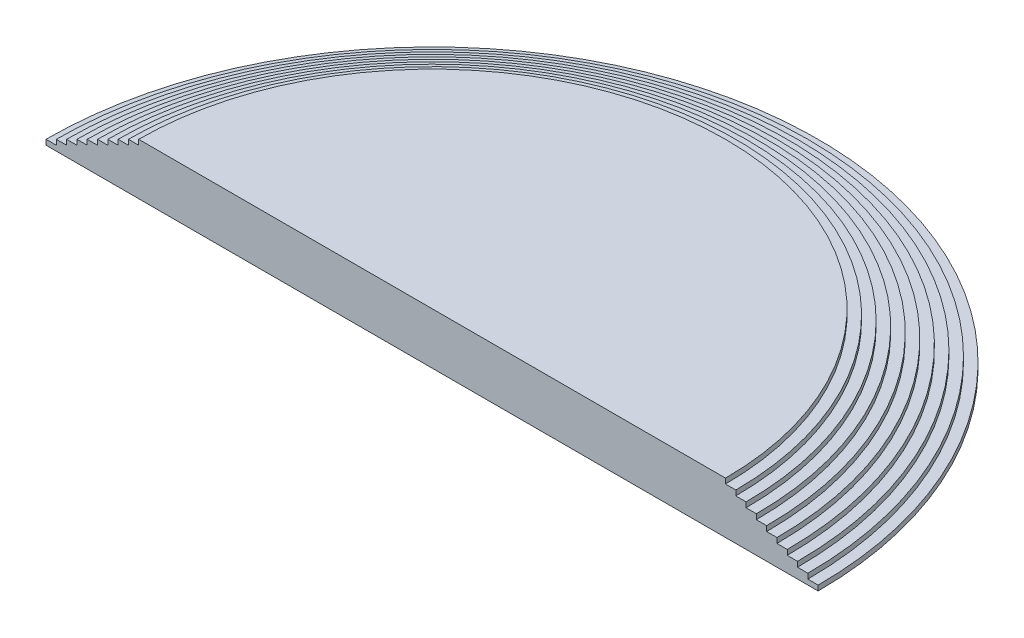
ISO-10303-21;
HEADER;
FILE_DESCRIPTION(('STEP AP214'),'2;1');
FILE_NAME('part.step','',(''),(''),'','','');
FILE_SCHEMA(('AUTOMOTIVE_DESIGN { 1 0 10303 214 1 1 1 1 }'));
ENDSEC;
DATA;
#1=APPLICATION_CONTEXT('core data for automotive mechanical design processes');
#2=APPLICATION_PROTOCOL_DEFINITION('international standard','automotive_design',2000,#1);
#3=PRODUCT_CONTEXT('',#1,'mechanical');
#4=PRODUCT('Part','Part','',(#3));
#5=PRODUCT_RELATED_PRODUCT_CATEGORY('part','',(#4));
#6=PRODUCT_DEFINITION_FORMATION('','',#4);
#7=PRODUCT_DEFINITION_CONTEXT('part definition',#1,'design');
#8=PRODUCT_DEFINITION('design','',#6,#7);
#9=PRODUCT_DEFINITION_SHAPE('','',#8);
#10=(LENGTH_UNIT() NAMED_UNIT(*) SI_UNIT(.MILLI.,.METRE.));
#11=(NAMED_UNIT(*) PLANE_ANGLE_UNIT() SI_UNIT($,.RADIAN.));
#12=(NAMED_UNIT(*) SI_UNIT($,.STERADIAN.) SOLID_ANGLE_UNIT());
#13=UNCERTAINTY_MEASURE_WITH_UNIT(LENGTH_MEASURE(1.E-05),#10,'distance_accuracy_value','');
#14=(GEOMETRIC_REPRESENTATION_CONTEXT(3) GLOBAL_UNCERTAINTY_ASSIGNED_CONTEXT((#13)) GLOBAL_UNIT_ASSIGNED_CONTEXT((#10,
#11,#12)) REPRESENTATION_CONTEXT('',''));
#15=CARTESIAN_POINT('',(0.,0.,0.));
#16=DIRECTION('',(0.,0.,1.));
#17=DIRECTION('',(1.,0.,0.));
#18=AXIS2_PLACEMENT_3D('',#15,#16,#17);
#19=CARTESIAN_POINT('',(0.,0.2,0.));
#20=DIRECTION('',(0.,-1.,0.));
#21=DIRECTION('',(0.,0.,-1.));
#22=AXIS2_PLACEMENT_3D('',#19,#20,#21);
#23=CYLINDRICAL_SURFACE('',#22,15.);
#24=CARTESIAN_POINT('',(0.,0.,0.));
#25=DIRECTION('',(0.,1.,0.));
#26=DIRECTION('',(0.,0.,1.));
#27=AXIS2_PLACEMENT_3D('',#24,#25,#26);
#28=CIRCLE('',#27,15.);
#29=CARTESIAN_POINT('',(15.,0.,0.));
#30=VERTEX_POINT('',#29);
#31=CARTESIAN_POINT('',(-15.,0.,0.));
#32=VERTEX_POINT('',#31);
#33=EDGE_CURVE('E309',#30,#32,#28,.T.);
#34=ORIENTED_EDGE('',*,*,#33,.T.);
#35=DIRECTION('',(0.,-1.,0.));
#36=VECTOR('',#35,1.);
#37=CARTESIAN_POINT('',(-15.,0.2,0.));
#38=LINE('',#37,#36);
#39=CARTESIAN_POINT('',(-15.,0.2,0.));
#40=VERTEX_POINT('',#39);
#41=EDGE_CURVE('E11',#40,#32,#38,.T.);
#42=ORIENTED_EDGE('',*,*,#41,.F.);
#43=CARTESIAN_POINT('',(0.,0.2,0.));
#44=DIRECTION('',(0.,1.,0.));
#45=DIRECTION('',(0.,0.,1.));
#46=AXIS2_PLACEMENT_3D('',#43,#44,#45);
#47=CIRCLE('',#46,15.);
#48=CARTESIAN_POINT('',(15.,0.2,0.));
#49=VERTEX_POINT('',#48);
#50=EDGE_CURVE('E310',#49,#40,#47,.T.);
#51=ORIENTED_EDGE('',*,*,#50,.F.);
#52=DIRECTION('',(0.,-1.,0.));
#53=VECTOR('',#52,1.);
#54=CARTESIAN_POINT('',(15.,0.2,0.));
#55=LINE('',#54,#53);
#56=EDGE_CURVE('E43',#49,#30,#55,.T.);
#57=ORIENTED_EDGE('',*,*,#56,.T.);
#58=EDGE_LOOP('',(#34,#42,#51,#57));
#59=FACE_BOUND('',#58,.T.);
#60=ADVANCED_FACE('F36',(#59),#23,.T.);
#61=CARTESIAN_POINT('',(-15.,0.2,0.));
#62=DIRECTION('',(0.,0.,-1.));
#63=DIRECTION('',(-1.,0.,0.));
#64=AXIS2_PLACEMENT_3D('',#61,#62,#63);
#65=PLANE('',#64);
#66=DIRECTION('',(1.,0.,0.));
#67=VECTOR('',#66,1.);
#68=CARTESIAN_POINT('',(-15.,0.,0.));
#69=LINE('',#68,#67);
#70=EDGE_CURVE('E314',#32,#30,#69,.T.);
#71=ORIENTED_EDGE('',*,*,#70,.T.);
#72=ORIENTED_EDGE('',*,*,#56,.F.);
#73=DIRECTION('',(1.,0.,0.));
#74=VECTOR('',#73,1.);
#75=CARTESIAN_POINT('',(-15.,0.2,0.));
#76=LINE('',#75,#74);
#77=CARTESIAN_POINT('',(14.6,0.2,0.));
#78=VERTEX_POINT('',#77);
#79=EDGE_CURVE('E313',#78,#49,#76,.T.);
#80=ORIENTED_EDGE('',*,*,#79,.F.);
#81=DIRECTION('',(0.,-1.,0.));
#82=VECTOR('',#81,1.);
#83=CARTESIAN_POINT('',(14.6,0.4,0.));
#84=LINE('',#83,#82);
#85=CARTESIAN_POINT('',(14.6,0.4,0.));
#86=VERTEX_POINT('',#85);
#87=EDGE_CURVE('E301',#86,#78,#84,.T.);
#88=ORIENTED_EDGE('',*,*,#87,.F.);
#89=DIRECTION('',(1.,0.,0.));
#90=VECTOR('',#89,1.);
#91=CARTESIAN_POINT('',(-14.6,0.4,0.));
#92=LINE('',#91,#90);
#93=CARTESIAN_POINT('',(14.2,0.4,0.));
#94=VERTEX_POINT('',#93);
#95=EDGE_CURVE('E298',#94,#86,#92,.T.);
#96=ORIENTED_EDGE('',*,*,#95,.F.);
#97=DIRECTION('',(0.,-1.,0.));
#98=VECTOR('',#97,1.);
#99=CARTESIAN_POINT('',(14.2,0.6,0.));
#100=LINE('',#99,#98);
#101=CARTESIAN_POINT('',(14.2,0.6,0.));
#102=VERTEX_POINT('',#101);
#103=EDGE_CURVE('E286',#102,#94,#100,.T.);
#104=ORIENTED_EDGE('',*,*,#103,.F.);
#105=DIRECTION('',(1.,0.,0.));
#106=VECTOR('',#105,1.);
#107=CARTESIAN_POINT('',(-14.2,0.6,0.));
#108=LINE('',#107,#106);
#109=CARTESIAN_POINT('',(13.8,0.6,0.));
#110=VERTEX_POINT('',#109);
#111=EDGE_CURVE('E283',#110,#102,#108,.T.);
#112=ORIENTED_EDGE('',*,*,#111,.F.);
#113=DIRECTION('',(0.,-1.,0.));
#114=VECTOR('',#113,1.);
#115=CARTESIAN_POINT('',(13.8,0.8,0.));
#116=LINE('',#115,#114);
#117=CARTESIAN_POINT('',(13.8,0.8,0.));
#118=VERTEX_POINT('',#117);
#119=EDGE_CURVE('E271',#118,#110,#116,.T.);
#120=ORIENTED_EDGE('',*,*,#119,.F.);
#121=DIRECTION('',(1.,0.,0.));
#122=VECTOR('',#121,1.);
#123=CARTESIAN_POINT('',(-13.8,0.8,0.));
#124=LINE('',#123,#122);
#125=CARTESIAN_POINT('',(13.4,0.8,0.));
#126=VERTEX_POINT('',#125);
#127=EDGE_CURVE('E268',#126,#118,#124,.T.);
#128=ORIENTED_EDGE('',*,*,#127,.F.);
#129=DIRECTION('',(0.,-1.,0.));
#130=VECTOR('',#129,1.);
#131=CARTESIAN_POINT('',(13.4,1.,0.));
#132=LINE('',#131,#130);
#133=CARTESIAN_POINT('',(13.4,1.,0.));
#134=VERTEX_POINT('',#133);
#135=EDGE_CURVE('E256',#134,#126,#132,.T.);
#136=ORIENTED_EDGE('',*,*,#135,.F.);
#137=DIRECTION('',(1.,0.,0.));
#138=VECTOR('',#137,1.);
#139=CARTESIAN_POINT('',(-13.4,1.,0.));
#140=LINE('',#139,#138);
#141=CARTESIAN_POINT('',(13.,1.,0.));
#142=VERTEX_POINT('',#141);
#143=EDGE_CURVE('E253',#142,#134,#140,.T.);
#144=ORIENTED_EDGE('',*,*,#143,.F.);
#145=DIRECTION('',(0.,-1.,0.));
#146=VECTOR('',#145,1.);
#147=CARTESIAN_POINT('',(13.,1.2,0.));
#148=LINE('',#147,#146);
#149=CARTESIAN_POINT('',(13.,1.2,0.));
#150=VERTEX_POINT('',#149);
#151=EDGE_CURVE('E241',#150,#142,#148,.T.);
#152=ORIENTED_EDGE('',*,*,#151,.F.);
#153=DIRECTION('',(1.,0.,0.));
#154=VECTOR('',#153,1.);
#155=CARTESIAN_POINT('',(-13.,1.2,0.));
#156=LINE('',#155,#154);
#157=CARTESIAN_POINT('',(12.6,1.2,0.));
#158=VERTEX_POINT('',#157);
#159=EDGE_CURVE('E238',#158,#150,#156,.T.);
#160=ORIENTED_EDGE('',*,*,#159,.F.);
#161=DIRECTION('',(0.,-1.,0.));
#162=VECTOR('',#161,1.);
#163=CARTESIAN_POINT('',(12.6,1.4,0.));
#164=LINE('',#163,#162);
#165=CARTESIAN_POINT('',(12.6,1.4,0.));
#166=VERTEX_POINT('',#165);
#167=EDGE_CURVE('E226',#166,#158,#164,.T.);
#168=ORIENTED_EDGE('',*,*,#167,.F.);
#169=DIRECTION('',(1.,0.,0.));
#170=VECTOR('',#169,1.);
#171=CARTESIAN_POINT('',(-12.6,1.4,0.));
#172=LINE('',#171,#170);
#173=CARTESIAN_POINT('',(12.2,1.4,0.));
#174=VERTEX_POINT('',#173);
#175=EDGE_CURVE('E223',#174,#166,#172,.T.);
#176=ORIENTED_EDGE('',*,*,#175,.F.);
#177=DIRECTION('',(0.,-1.,0.));
#178=VECTOR('',#177,1.);
#179=CARTESIAN_POINT('',(12.2,1.6,0.));
#180=LINE('',#179,#178);
#181=CARTESIAN_POINT('',(12.2,1.6,0.));
#182=VERTEX_POINT('',#181);
#183=EDGE_CURVE('E211',#182,#174,#180,.T.);
#184=ORIENTED_EDGE('',*,*,#183,.F.);
#185=DIRECTION('',(1.,0.,0.));
#186=VECTOR('',#185,1.);
#187=CARTESIAN_POINT('',(-12.2,1.6,0.));
#188=LINE('',#187,#186);
#189=CARTESIAN_POINT('',(11.8,1.6,0.));
#190=VERTEX_POINT('',#189);
#191=EDGE_CURVE('E208',#190,#182,#188,.T.);
#192=ORIENTED_EDGE('',*,*,#191,.F.);
#193=DIRECTION('',(0.,-1.,0.));
#194=VECTOR('',#193,1.);
#195=CARTESIAN_POINT('',(11.8,1.8,0.));
#196=LINE('',#195,#194);
#197=CARTESIAN_POINT('',(11.8,1.8,0.));
#198=VERTEX_POINT('',#197);
#199=EDGE_CURVE('E197',#198,#190,#196,.T.);
#200=ORIENTED_EDGE('',*,*,#199,.F.);
#201=DIRECTION('',(1.,0.,0.));
#202=VECTOR('',#201,1.);
#203=CARTESIAN_POINT('',(-11.8,1.8,0.));
#204=LINE('',#203,#202);
#205=CARTESIAN_POINT('',(11.4,1.8,0.));
#206=VERTEX_POINT('',#205);
#207=EDGE_CURVE('E195',#206,#198,#204,.T.);
#208=ORIENTED_EDGE('',*,*,#207,.F.);
#209=DIRECTION('',(0.,-1.,0.));
#210=VECTOR('',#209,1.);
#211=CARTESIAN_POINT('',(11.4,2.,0.));
#212=LINE('',#211,#210);
#213=CARTESIAN_POINT('',(11.4,2.,0.));
#214=VERTEX_POINT('',#213);
#215=EDGE_CURVE('E178',#214,#206,#212,.T.);
#216=ORIENTED_EDGE('',*,*,#215,.F.);
#217=DIRECTION('',(1.,0.,0.));
#218=VECTOR('',#217,1.);
#219=CARTESIAN_POINT('',(-11.4,2.,0.));
#220=LINE('',#219,#218);
#221=CARTESIAN_POINT('',(-11.4,2.,0.));
#222=VERTEX_POINT('',#221);
#223=EDGE_CURVE('E172',#222,#214,#220,.T.);
#224=ORIENTED_EDGE('',*,*,#223,.F.);
#225=DIRECTION('',(0.,-1.,0.));
#226=VECTOR('',#225,1.);
#227=CARTESIAN_POINT('',(-11.4,2.,0.));
#228=LINE('',#227,#226);
#229=CARTESIAN_POINT('',(-11.4,1.8,0.));
#230=VERTEX_POINT('',#229);
#231=EDGE_CURVE('E176',#222,#230,#228,.T.);
#232=ORIENTED_EDGE('',*,*,#231,.T.);
#233=CARTESIAN_POINT('',(-11.8,1.8,0.));
#234=VERTEX_POINT('',#233);
#235=EDGE_CURVE('E196',#234,#230,#204,.T.);
#236=ORIENTED_EDGE('',*,*,#235,.F.);
#237=DIRECTION('',(0.,-1.,0.));
#238=VECTOR('',#237,1.);
#239=CARTESIAN_POINT('',(-11.8,1.8,0.));
#240=LINE('',#239,#238);
#241=CARTESIAN_POINT('',(-11.8,1.6,0.));
#242=VERTEX_POINT('',#241);
#243=EDGE_CURVE('E201',#234,#242,#240,.T.);
#244=ORIENTED_EDGE('',*,*,#243,.T.);
#245=CARTESIAN_POINT('',(-12.2,1.6,0.));
#246=VERTEX_POINT('',#245);
#247=EDGE_CURVE('E209',#246,#242,#188,.T.);
#248=ORIENTED_EDGE('',*,*,#247,.F.);
#249=DIRECTION('',(0.,-1.,0.));
#250=VECTOR('',#249,1.);
#251=CARTESIAN_POINT('',(-12.2,1.6,0.));
#252=LINE('',#251,#250);
#253=CARTESIAN_POINT('',(-12.2,1.4,0.));
#254=VERTEX_POINT('',#253);
#255=EDGE_CURVE('E216',#246,#254,#252,.T.);
#256=ORIENTED_EDGE('',*,*,#255,.T.);
#257=CARTESIAN_POINT('',(-12.6,1.4,0.));
#258=VERTEX_POINT('',#257);
#259=EDGE_CURVE('E224',#258,#254,#172,.T.);
#260=ORIENTED_EDGE('',*,*,#259,.F.);
#261=DIRECTION('',(0.,-1.,0.));
#262=VECTOR('',#261,1.);
#263=CARTESIAN_POINT('',(-12.6,1.4,0.));
#264=LINE('',#263,#262);
#265=CARTESIAN_POINT('',(-12.6,1.2,0.));
#266=VERTEX_POINT('',#265);
#267=EDGE_CURVE('E231',#258,#266,#264,.T.);
#268=ORIENTED_EDGE('',*,*,#267,.T.);
#269=CARTESIAN_POINT('',(-13.,1.2,0.));
#270=VERTEX_POINT('',#269);
#271=EDGE_CURVE('E239',#270,#266,#156,.T.);
#272=ORIENTED_EDGE('',*,*,#271,.F.);
#273=DIRECTION('',(0.,-1.,0.));
#274=VECTOR('',#273,1.);
#275=CARTESIAN_POINT('',(-13.,1.2,0.));
#276=LINE('',#275,#274);
#277=CARTESIAN_POINT('',(-13.,1.,0.));
#278=VERTEX_POINT('',#277);
#279=EDGE_CURVE('E246',#270,#278,#276,.T.);
#280=ORIENTED_EDGE('',*,*,#279,.T.);
#281=CARTESIAN_POINT('',(-13.4,1.,0.));
#282=VERTEX_POINT('',#281);
#283=EDGE_CURVE('E254',#282,#278,#140,.T.);
#284=ORIENTED_EDGE('',*,*,#283,.F.);
#285=DIRECTION('',(0.,-1.,0.));
#286=VECTOR('',#285,1.);
#287=CARTESIAN_POINT('',(-13.4,1.,0.));
#288=LINE('',#287,#286);
#289=CARTESIAN_POINT('',(-13.4,0.8,0.));
#290=VERTEX_POINT('',#289);
#291=EDGE_CURVE('E261',#282,#290,#288,.T.);
#292=ORIENTED_EDGE('',*,*,#291,.T.);
#293=CARTESIAN_POINT('',(-13.8,0.8,0.));
#294=VERTEX_POINT('',#293);
#295=EDGE_CURVE('E269',#294,#290,#124,.T.);
#296=ORIENTED_EDGE('',*,*,#295,.F.);
#297=DIRECTION('',(0.,-1.,0.));
#298=VECTOR('',#297,1.);
#299=CARTESIAN_POINT('',(-13.8,0.8,0.));
#300=LINE('',#299,#298);
#301=CARTESIAN_POINT('',(-13.8,0.6,0.));
#302=VERTEX_POINT('',#301);
#303=EDGE_CURVE('E276',#294,#302,#300,.T.);
#304=ORIENTED_EDGE('',*,*,#303,.T.);
#305=CARTESIAN_POINT('',(-14.2,0.6,0.));
#306=VERTEX_POINT('',#305);
#307=EDGE_CURVE('E284',#306,#302,#108,.T.);
#308=ORIENTED_EDGE('',*,*,#307,.F.);
#309=DIRECTION('',(0.,-1.,0.));
#310=VECTOR('',#309,1.);
#311=CARTESIAN_POINT('',(-14.2,0.6,0.));
#312=LINE('',#311,#310);
#313=CARTESIAN_POINT('',(-14.2,0.4,0.));
#314=VERTEX_POINT('',#313);
#315=EDGE_CURVE('E291',#306,#314,#312,.T.);
#316=ORIENTED_EDGE('',*,*,#315,.T.);
#317=CARTESIAN_POINT('',(-14.6,0.4,0.));
#318=VERTEX_POINT('',#317);
#319=EDGE_CURVE('E299',#318,#314,#92,.T.);
#320=ORIENTED_EDGE('',*,*,#319,.F.);
#321=DIRECTION('',(0.,-1.,0.));
#322=VECTOR('',#321,1.);
#323=CARTESIAN_POINT('',(-14.6,0.4,0.));
#324=LINE('',#323,#322);
#325=CARTESIAN_POINT('',(-14.6,0.2,0.));
#326=VERTEX_POINT('',#325);
#327=EDGE_CURVE('E306',#318,#326,#324,.T.);
#328=ORIENTED_EDGE('',*,*,#327,.T.);
#329=EDGE_CURVE('E315',#40,#326,#76,.T.);
#330=ORIENTED_EDGE('',*,*,#329,.F.);
#331=ORIENTED_EDGE('',*,*,#41,.T.);
#332=EDGE_LOOP('',(#71,#72,#80,#88,#96,#104,#112,#120,#128,#136,#144,#152,#160,#168,#176,#184,
#192,#200,#208,#216,#224,#232,#236,#244,#248,#256,#260,#268,#272,#280,#284,#292,#296,#304,#308,
#316,#320,#328,#330,#331));
#333=FACE_BOUND('',#332,.T.);
#334=ADVANCED_FACE('F174',(#333),#65,.F.);
#335=CARTESIAN_POINT('',(0.,0.2,0.));
#336=DIRECTION('',(0.,1.,0.));
#337=DIRECTION('',(0.,0.,1.));
#338=AXIS2_PLACEMENT_3D('',#335,#336,#337);
#339=PLANE('',#338);
#340=CARTESIAN_POINT('',(0.,0.2,0.));
#341=DIRECTION('',(0.,1.,0.));
#342=DIRECTION('',(0.,0.,1.));
#343=AXIS2_PLACEMENT_3D('',#340,#341,#342);
#344=CIRCLE('',#343,14.6);
#345=EDGE_CURVE('E294',#78,#326,#344,.T.);
#346=ORIENTED_EDGE('',*,*,#345,.F.);
#347=ORIENTED_EDGE('',*,*,#79,.T.);
#348=ORIENTED_EDGE('',*,*,#50,.T.);
#349=ORIENTED_EDGE('',*,*,#329,.T.);
#350=EDGE_LOOP('',(#346,#347,#348,#349));
#351=FACE_BOUND('',#350,.T.);
#352=ADVANCED_FACE('F330',(#351),#339,.T.);
#353=CARTESIAN_POINT('',(0.,0.,0.));
#354=DIRECTION('',(0.,1.,0.));
#355=DIRECTION('',(0.,0.,1.));
#356=AXIS2_PLACEMENT_3D('',#353,#354,#355);
#357=PLANE('',#356);
#358=ORIENTED_EDGE('',*,*,#33,.F.);
#359=ORIENTED_EDGE('',*,*,#70,.F.);
#360=EDGE_LOOP('',(#358,#359));
#361=FACE_BOUND('',#360,.T.);
#362=ADVANCED_FACE('F327',(#361),#357,.F.);
#363=CARTESIAN_POINT('',(0.,0.4,0.));
#364=DIRECTION('',(0.,-1.,0.));
#365=DIRECTION('',(0.,0.,-1.));
#366=AXIS2_PLACEMENT_3D('',#363,#364,#365);
#367=CYLINDRICAL_SURFACE('',#366,14.6);
#368=ORIENTED_EDGE('',*,*,#345,.T.);
#369=ORIENTED_EDGE('',*,*,#327,.F.);
#370=CARTESIAN_POINT('',(0.,0.4,0.));
#371=DIRECTION('',(0.,1.,0.));
#372=DIRECTION('',(0.,0.,1.));
#373=AXIS2_PLACEMENT_3D('',#370,#371,#372);
#374=CIRCLE('',#373,14.6);
#375=EDGE_CURVE('E295',#86,#318,#374,.T.);
#376=ORIENTED_EDGE('',*,*,#375,.F.);
#377=ORIENTED_EDGE('',*,*,#87,.T.);
#378=EDGE_LOOP('',(#368,#369,#376,#377));
#379=FACE_BOUND('',#378,.T.);
#380=ADVANCED_FACE('F335',(#379),#367,.T.);
#381=CARTESIAN_POINT('',(0.,0.4,0.));
#382=DIRECTION('',(0.,1.,0.));
#383=DIRECTION('',(0.,0.,1.));
#384=AXIS2_PLACEMENT_3D('',#381,#382,#383);
#385=PLANE('',#384);
#386=CARTESIAN_POINT('',(0.,0.4,0.));
#387=DIRECTION('',(0.,1.,0.));
#388=DIRECTION('',(0.,0.,1.));
#389=AXIS2_PLACEMENT_3D('',#386,#387,#388);
#390=CIRCLE('',#389,14.2);
#391=EDGE_CURVE('E279',#94,#314,#390,.T.);
#392=ORIENTED_EDGE('',*,*,#391,.F.);
#393=ORIENTED_EDGE('',*,*,#95,.T.);
#394=ORIENTED_EDGE('',*,*,#375,.T.);
#395=ORIENTED_EDGE('',*,*,#319,.T.);
#396=EDGE_LOOP('',(#392,#393,#394,#395));
#397=FACE_BOUND('',#396,.T.);
#398=ADVANCED_FACE('F337',(#397),#385,.T.);
#399=CARTESIAN_POINT('',(0.,0.6,0.));
#400=DIRECTION('',(0.,-1.,0.));
#401=DIRECTION('',(0.,0.,-1.));
#402=AXIS2_PLACEMENT_3D('',#399,#400,#401);
#403=CYLINDRICAL_SURFACE('',#402,14.2);
#404=ORIENTED_EDGE('',*,*,#391,.T.);
#405=ORIENTED_EDGE('',*,*,#315,.F.);
#406=CARTESIAN_POINT('',(0.,0.6,0.));
#407=DIRECTION('',(0.,1.,0.));
#408=DIRECTION('',(0.,0.,1.));
#409=AXIS2_PLACEMENT_3D('',#406,#407,#408);
#410=CIRCLE('',#409,14.2);
#411=EDGE_CURVE('E280',#102,#306,#410,.T.);
#412=ORIENTED_EDGE('',*,*,#411,.F.);
#413=ORIENTED_EDGE('',*,*,#103,.T.);
#414=EDGE_LOOP('',(#404,#405,#412,#413));
#415=FACE_BOUND('',#414,.T.);
#416=ADVANCED_FACE('F342',(#415),#403,.T.);
#417=CARTESIAN_POINT('',(0.,0.6,0.));
#418=DIRECTION('',(0.,1.,0.));
#419=DIRECTION('',(0.,0.,1.));
#420=AXIS2_PLACEMENT_3D('',#417,#418,#419);
#421=PLANE('',#420);
#422=CARTESIAN_POINT('',(0.,0.6,0.));
#423=DIRECTION('',(0.,1.,0.));
#424=DIRECTION('',(0.,0.,1.));
#425=AXIS2_PLACEMENT_3D('',#422,#423,#424);
#426=CIRCLE('',#425,13.8);
#427=EDGE_CURVE('E264',#110,#302,#426,.T.);
#428=ORIENTED_EDGE('',*,*,#427,.F.);
#429=ORIENTED_EDGE('',*,*,#111,.T.);
#430=ORIENTED_EDGE('',*,*,#411,.T.);
#431=ORIENTED_EDGE('',*,*,#307,.T.);
#432=EDGE_LOOP('',(#428,#429,#430,#431));
#433=FACE_BOUND('',#432,.T.);
#434=ADVANCED_FACE('F345',(#433),#421,.T.);
#435=CARTESIAN_POINT('',(0.,0.8,0.));
#436=DIRECTION('',(0.,-1.,0.));
#437=DIRECTION('',(0.,0.,-1.));
#438=AXIS2_PLACEMENT_3D('',#435,#436,#437);
#439=CYLINDRICAL_SURFACE('',#438,13.8);
#440=ORIENTED_EDGE('',*,*,#427,.T.);
#441=ORIENTED_EDGE('',*,*,#303,.F.);
#442=CARTESIAN_POINT('',(0.,0.8,0.));
#443=DIRECTION('',(0.,1.,0.));
#444=DIRECTION('',(0.,0.,1.));
#445=AXIS2_PLACEMENT_3D('',#442,#443,#444);
#446=CIRCLE('',#445,13.8);
#447=EDGE_CURVE('E265',#118,#294,#446,.T.);
#448=ORIENTED_EDGE('',*,*,#447,.F.);
#449=ORIENTED_EDGE('',*,*,#119,.T.);
#450=EDGE_LOOP('',(#440,#441,#448,#449));
#451=FACE_BOUND('',#450,.T.);
#452=ADVANCED_FACE('F350',(#451),#439,.T.);
#453=CARTESIAN_POINT('',(0.,0.8,0.));
#454=DIRECTION('',(0.,1.,0.));
#455=DIRECTION('',(0.,0.,1.));
#456=AXIS2_PLACEMENT_3D('',#453,#454,#455);
#457=PLANE('',#456);
#458=CARTESIAN_POINT('',(0.,0.8,0.));
#459=DIRECTION('',(0.,1.,0.));
#460=DIRECTION('',(0.,0.,1.));
#461=AXIS2_PLACEMENT_3D('',#458,#459,#460);
#462=CIRCLE('',#461,13.4);
#463=EDGE_CURVE('E249',#126,#290,#462,.T.);
#464=ORIENTED_EDGE('',*,*,#463,.F.);
#465=ORIENTED_EDGE('',*,*,#127,.T.);
#466=ORIENTED_EDGE('',*,*,#447,.T.);
#467=ORIENTED_EDGE('',*,*,#295,.T.);
#468=EDGE_LOOP('',(#464,#465,#466,#467));
#469=FACE_BOUND('',#468,.T.);
#470=ADVANCED_FACE('F353',(#469),#457,.T.);
#471=CARTESIAN_POINT('',(0.,1.,0.));
#472=DIRECTION('',(0.,-1.,0.));
#473=DIRECTION('',(0.,0.,-1.));
#474=AXIS2_PLACEMENT_3D('',#471,#472,#473);
#475=CYLINDRICAL_SURFACE('',#474,13.4);
#476=ORIENTED_EDGE('',*,*,#463,.T.);
#477=ORIENTED_EDGE('',*,*,#291,.F.);
#478=CARTESIAN_POINT('',(0.,1.,0.));
#479=DIRECTION('',(0.,1.,0.));
#480=DIRECTION('',(0.,0.,1.));
#481=AXIS2_PLACEMENT_3D('',#478,#479,#480);
#482=CIRCLE('',#481,13.4);
#483=EDGE_CURVE('E250',#134,#282,#482,.T.);
#484=ORIENTED_EDGE('',*,*,#483,.F.);
#485=ORIENTED_EDGE('',*,*,#135,.T.);
#486=EDGE_LOOP('',(#476,#477,#484,#485));
#487=FACE_BOUND('',#486,.T.);
#488=ADVANCED_FACE('F358',(#487),#475,.T.);
#489=CARTESIAN_POINT('',(0.,1.,0.));
#490=DIRECTION('',(0.,1.,0.));
#491=DIRECTION('',(0.,0.,1.));
#492=AXIS2_PLACEMENT_3D('',#489,#490,#491);
#493=PLANE('',#492);
#494=CARTESIAN_POINT('',(0.,1.,0.));
#495=DIRECTION('',(0.,1.,0.));
#496=DIRECTION('',(0.,0.,1.));
#497=AXIS2_PLACEMENT_3D('',#494,#495,#496);
#498=CIRCLE('',#497,13.);
#499=EDGE_CURVE('E234',#142,#278,#498,.T.);
#500=ORIENTED_EDGE('',*,*,#499,.F.);
#501=ORIENTED_EDGE('',*,*,#143,.T.);
#502=ORIENTED_EDGE('',*,*,#483,.T.);
#503=ORIENTED_EDGE('',*,*,#283,.T.);
#504=EDGE_LOOP('',(#500,#501,#502,#503));
#505=FACE_BOUND('',#504,.T.);
#506=ADVANCED_FACE('F361',(#505),#493,.T.);
#507=CARTESIAN_POINT('',(0.,1.2,0.));
#508=DIRECTION('',(0.,-1.,0.));
#509=DIRECTION('',(0.,0.,-1.));
#510=AXIS2_PLACEMENT_3D('',#507,#508,#509);
#511=CYLINDRICAL_SURFACE('',#510,13.);
#512=ORIENTED_EDGE('',*,*,#499,.T.);
#513=ORIENTED_EDGE('',*,*,#279,.F.);
#514=CARTESIAN_POINT('',(0.,1.2,0.));
#515=DIRECTION('',(0.,1.,0.));
#516=DIRECTION('',(0.,0.,1.));
#517=AXIS2_PLACEMENT_3D('',#514,#515,#516);
#518=CIRCLE('',#517,13.);
#519=EDGE_CURVE('E235',#150,#270,#518,.T.);
#520=ORIENTED_EDGE('',*,*,#519,.F.);
#521=ORIENTED_EDGE('',*,*,#151,.T.);
#522=EDGE_LOOP('',(#512,#513,#520,#521));
#523=FACE_BOUND('',#522,.T.);
#524=ADVANCED_FACE('F366',(#523),#511,.T.);
#525=CARTESIAN_POINT('',(0.,1.2,0.));
#526=DIRECTION('',(0.,1.,0.));
#527=DIRECTION('',(0.,0.,1.));
#528=AXIS2_PLACEMENT_3D('',#525,#526,#527);
#529=PLANE('',#528);
#530=CARTESIAN_POINT('',(0.,1.2,0.));
#531=DIRECTION('',(0.,1.,0.));
#532=DIRECTION('',(0.,0.,1.));
#533=AXIS2_PLACEMENT_3D('',#530,#531,#532);
#534=CIRCLE('',#533,12.6);
#535=EDGE_CURVE('E219',#158,#266,#534,.T.);
#536=ORIENTED_EDGE('',*,*,#535,.F.);
#537=ORIENTED_EDGE('',*,*,#159,.T.);
#538=ORIENTED_EDGE('',*,*,#519,.T.);
#539=ORIENTED_EDGE('',*,*,#271,.T.);
#540=EDGE_LOOP('',(#536,#537,#538,#539));
#541=FACE_BOUND('',#540,.T.);
#542=ADVANCED_FACE('F369',(#541),#529,.T.);
#543=CARTESIAN_POINT('',(0.,1.4,0.));
#544=DIRECTION('',(0.,-1.,0.));
#545=DIRECTION('',(0.,0.,-1.));
#546=AXIS2_PLACEMENT_3D('',#543,#544,#545);
#547=CYLINDRICAL_SURFACE('',#546,12.6);
#548=ORIENTED_EDGE('',*,*,#535,.T.);
#549=ORIENTED_EDGE('',*,*,#267,.F.);
#550=CARTESIAN_POINT('',(0.,1.4,0.));
#551=DIRECTION('',(0.,1.,0.));
#552=DIRECTION('',(0.,0.,1.));
#553=AXIS2_PLACEMENT_3D('',#550,#551,#552);
#554=CIRCLE('',#553,12.6);
#555=EDGE_CURVE('E220',#166,#258,#554,.T.);
#556=ORIENTED_EDGE('',*,*,#555,.F.);
#557=ORIENTED_EDGE('',*,*,#167,.T.);
#558=EDGE_LOOP('',(#548,#549,#556,#557));
#559=FACE_BOUND('',#558,.T.);
#560=ADVANCED_FACE('F374',(#559),#547,.T.);
#561=CARTESIAN_POINT('',(0.,1.4,0.));
#562=DIRECTION('',(0.,1.,0.));
#563=DIRECTION('',(0.,0.,1.));
#564=AXIS2_PLACEMENT_3D('',#561,#562,#563);
#565=PLANE('',#564);
#566=CARTESIAN_POINT('',(0.,1.4,0.));
#567=DIRECTION('',(0.,1.,0.));
#568=DIRECTION('',(0.,0.,1.));
#569=AXIS2_PLACEMENT_3D('',#566,#567,#568);
#570=CIRCLE('',#569,12.2);
#571=EDGE_CURVE('E204',#174,#254,#570,.T.);
#572=ORIENTED_EDGE('',*,*,#571,.F.);
#573=ORIENTED_EDGE('',*,*,#175,.T.);
#574=ORIENTED_EDGE('',*,*,#555,.T.);
#575=ORIENTED_EDGE('',*,*,#259,.T.);
#576=EDGE_LOOP('',(#572,#573,#574,#575));
#577=FACE_BOUND('',#576,.T.);
#578=ADVANCED_FACE('F377',(#577),#565,.T.);
#579=CARTESIAN_POINT('',(0.,1.6,0.));
#580=DIRECTION('',(0.,-1.,0.));
#581=DIRECTION('',(0.,0.,-1.));
#582=AXIS2_PLACEMENT_3D('',#579,#580,#581);
#583=CYLINDRICAL_SURFACE('',#582,12.2);
#584=ORIENTED_EDGE('',*,*,#571,.T.);
#585=ORIENTED_EDGE('',*,*,#255,.F.);
#586=CARTESIAN_POINT('',(0.,1.6,0.));
#587=DIRECTION('',(0.,1.,0.));
#588=DIRECTION('',(0.,0.,1.));
#589=AXIS2_PLACEMENT_3D('',#586,#587,#588);
#590=CIRCLE('',#589,12.2);
#591=EDGE_CURVE('E205',#182,#246,#590,.T.);
#592=ORIENTED_EDGE('',*,*,#591,.F.);
#593=ORIENTED_EDGE('',*,*,#183,.T.);
#594=EDGE_LOOP('',(#584,#585,#592,#593));
#595=FACE_BOUND('',#594,.T.);
#596=ADVANCED_FACE('F381',(#595),#583,.T.);
#597=CARTESIAN_POINT('',(0.,1.6,0.));
#598=DIRECTION('',(0.,1.,0.));
#599=DIRECTION('',(0.,0.,1.));
#600=AXIS2_PLACEMENT_3D('',#597,#598,#599);
#601=PLANE('',#600);
#602=CARTESIAN_POINT('',(0.,1.6,0.));
#603=DIRECTION('',(0.,1.,0.));
#604=DIRECTION('',(0.,0.,1.));
#605=AXIS2_PLACEMENT_3D('',#602,#603,#604);
#606=CIRCLE('',#605,11.8);
#607=EDGE_CURVE('E58',#190,#242,#606,.T.);
#608=ORIENTED_EDGE('',*,*,#607,.F.);
#609=ORIENTED_EDGE('',*,*,#191,.T.);
#610=ORIENTED_EDGE('',*,*,#591,.T.);
#611=ORIENTED_EDGE('',*,*,#247,.T.);
#612=EDGE_LOOP('',(#608,#609,#610,#611));
#613=FACE_BOUND('',#612,.T.);
#614=ADVANCED_FACE('F383',(#613),#601,.T.);
#615=CARTESIAN_POINT('',(0.,1.8,0.));
#616=DIRECTION('',(0.,-1.,0.));
#617=DIRECTION('',(0.,0.,-1.));
#618=AXIS2_PLACEMENT_3D('',#615,#616,#617);
#619=CYLINDRICAL_SURFACE('',#618,11.8);
#620=ORIENTED_EDGE('',*,*,#607,.T.);
#621=ORIENTED_EDGE('',*,*,#243,.F.);
#622=CARTESIAN_POINT('',(0.,1.8,0.));
#623=DIRECTION('',(0.,1.,0.));
#624=DIRECTION('',(0.,0.,1.));
#625=AXIS2_PLACEMENT_3D('',#622,#623,#624);
#626=CIRCLE('',#625,11.8);
#627=EDGE_CURVE('E188',#198,#234,#626,.T.);
#628=ORIENTED_EDGE('',*,*,#627,.F.);
#629=ORIENTED_EDGE('',*,*,#199,.T.);
#630=EDGE_LOOP('',(#620,#621,#628,#629));
#631=FACE_BOUND('',#630,.T.);
#632=ADVANCED_FACE('F387',(#631),#619,.T.);
#633=CARTESIAN_POINT('',(0.,1.8,0.));
#634=DIRECTION('',(0.,1.,0.));
#635=DIRECTION('',(0.,0.,1.));
#636=AXIS2_PLACEMENT_3D('',#633,#634,#635);
#637=PLANE('',#636);
#638=CARTESIAN_POINT('',(0.,1.8,0.));
#639=DIRECTION('',(0.,1.,0.));
#640=DIRECTION('',(0.,0.,1.));
#641=AXIS2_PLACEMENT_3D('',#638,#639,#640);
#642=CIRCLE('',#641,11.4);
#643=EDGE_CURVE('E50',#206,#230,#642,.T.);
#644=ORIENTED_EDGE('',*,*,#643,.F.);
#645=ORIENTED_EDGE('',*,*,#207,.T.);
#646=ORIENTED_EDGE('',*,*,#627,.T.);
#647=ORIENTED_EDGE('',*,*,#235,.T.);
#648=EDGE_LOOP('',(#644,#645,#646,#647));
#649=FACE_BOUND('',#648,.T.);
#650=ADVANCED_FACE('F389',(#649),#637,.T.);
#651=CARTESIAN_POINT('',(0.,2.,0.));
#652=DIRECTION('',(0.,-1.,0.));
#653=DIRECTION('',(0.,0.,-1.));
#654=AXIS2_PLACEMENT_3D('',#651,#652,#653);
#655=CYLINDRICAL_SURFACE('',#654,11.4);
#656=ORIENTED_EDGE('',*,*,#643,.T.);
#657=ORIENTED_EDGE('',*,*,#231,.F.);
#658=CARTESIAN_POINT('',(0.,2.,0.));
#659=DIRECTION('',(0.,1.,0.));
#660=DIRECTION('',(0.,0.,1.));
#661=AXIS2_PLACEMENT_3D('',#658,#659,#660);
#662=CIRCLE('',#661,11.4);
#663=EDGE_CURVE('E181',#214,#222,#662,.T.);
#664=ORIENTED_EDGE('',*,*,#663,.F.);
#665=ORIENTED_EDGE('',*,*,#215,.T.);
#666=EDGE_LOOP('',(#656,#657,#664,#665));
#667=FACE_BOUND('',#666,.T.);
#668=ADVANCED_FACE('F186',(#667),#655,.T.);
#669=CARTESIAN_POINT('',(0.,2.,0.));
#670=DIRECTION('',(0.,1.,0.));
#671=DIRECTION('',(0.,0.,1.));
#672=AXIS2_PLACEMENT_3D('',#669,#670,#671);
#673=PLANE('',#672);
#674=ORIENTED_EDGE('',*,*,#663,.T.);
#675=ORIENTED_EDGE('',*,*,#223,.T.);
#676=EDGE_LOOP('',(#674,#675));
#677=FACE_BOUND('',#676,.T.);
#678=ADVANCED_FACE('F183',(#677),#673,.T.);
#679=CLOSED_SHELL('',(#60,#334,#352,#362,#380,#398,#416,#434,#452,#470,#488,#506,#524,#542,#560,
#578,#596,#614,#632,#650,#668,#678));
#680=MANIFOLD_SOLID_BREP('B2',#679);
#681=ADVANCED_BREP_SHAPE_REPRESENTATION('',(#18,#680),#14);
#682=SHAPE_DEFINITION_REPRESENTATION(#9,#681);
ENDSEC;
END-ISO-10303-21;
